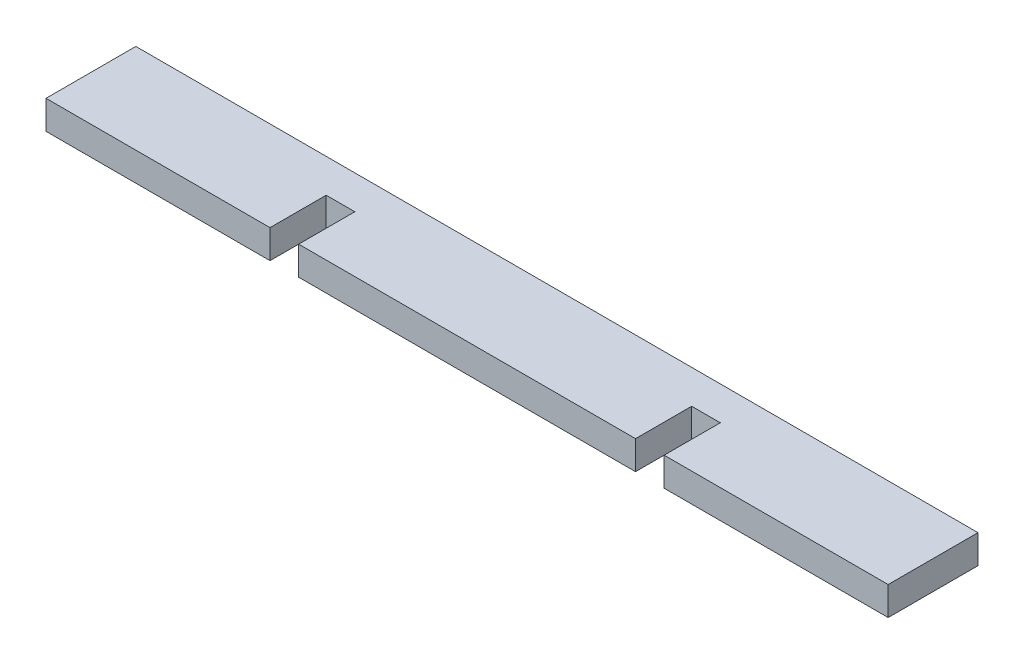
ISO-10303-21;
HEADER;
FILE_DESCRIPTION(('STEP AP214'),'2;1');
FILE_NAME('part.step','',(''),(''),'','','');
FILE_SCHEMA(('AUTOMOTIVE_DESIGN { 1 0 10303 214 1 1 1 1 }'));
ENDSEC;
DATA;
#1=APPLICATION_CONTEXT('core data for automotive mechanical design processes');
#2=APPLICATION_PROTOCOL_DEFINITION('international standard','automotive_design',2000,#1);
#3=PRODUCT_CONTEXT('',#1,'mechanical');
#4=PRODUCT('Part','Part','',(#3));
#5=PRODUCT_RELATED_PRODUCT_CATEGORY('part','',(#4));
#6=PRODUCT_DEFINITION_FORMATION('','',#4);
#7=PRODUCT_DEFINITION_CONTEXT('part definition',#1,'design');
#8=PRODUCT_DEFINITION('design','',#6,#7);
#9=PRODUCT_DEFINITION_SHAPE('','',#8);
#10=(LENGTH_UNIT() NAMED_UNIT(*) SI_UNIT(.MILLI.,.METRE.));
#11=(NAMED_UNIT(*) PLANE_ANGLE_UNIT() SI_UNIT($,.RADIAN.));
#12=(NAMED_UNIT(*) SI_UNIT($,.STERADIAN.) SOLID_ANGLE_UNIT());
#13=UNCERTAINTY_MEASURE_WITH_UNIT(LENGTH_MEASURE(1.E-05),#10,'distance_accuracy_value','');
#14=(GEOMETRIC_REPRESENTATION_CONTEXT(3) GLOBAL_UNCERTAINTY_ASSIGNED_CONTEXT((#13)) GLOBAL_UNIT_ASSIGNED_CONTEXT((#10,
#11,#12)) REPRESENTATION_CONTEXT('',''));
#15=CARTESIAN_POINT('',(0.,0.,0.));
#16=DIRECTION('',(0.,0.,1.));
#17=DIRECTION('',(1.,0.,0.));
#18=AXIS2_PLACEMENT_3D('',#15,#16,#17);
#19=CARTESIAN_POINT('',(-75.,5.1,8.00000000000001));
#20=DIRECTION('',(1.,0.,0.));
#21=DIRECTION('',(0.,0.,-1.));
#22=AXIS2_PLACEMENT_3D('',#19,#20,#21);
#23=PLANE('',#22);
#24=DIRECTION('',(0.,0.,1.));
#25=VECTOR('',#24,1.);
#26=CARTESIAN_POINT('',(-75.,0.,8.00000000000001));
#27=LINE('',#26,#25);
#28=CARTESIAN_POINT('',(-75.,0.,-7.99999999999999));
#29=VERTEX_POINT('',#28);
#30=CARTESIAN_POINT('',(-75.,0.,8.00000000000001));
#31=VERTEX_POINT('',#30);
#32=EDGE_CURVE('E153',#29,#31,#27,.T.);
#33=ORIENTED_EDGE('',*,*,#32,.T.);
#34=DIRECTION('',(0.,-1.,0.));
#35=VECTOR('',#34,1.);
#36=CARTESIAN_POINT('',(-75.,5.1,8.00000000000001));
#37=LINE('',#36,#35);
#38=CARTESIAN_POINT('',(-75.,5.1,8.00000000000001));
#39=VERTEX_POINT('',#38);
#40=EDGE_CURVE('E11',#39,#31,#37,.T.);
#41=ORIENTED_EDGE('',*,*,#40,.F.);
#42=DIRECTION('',(0.,0.,1.));
#43=VECTOR('',#42,1.);
#44=CARTESIAN_POINT('',(-75.,5.1,8.00000000000001));
#45=LINE('',#44,#43);
#46=CARTESIAN_POINT('',(-75.,5.1,-7.99999999999999));
#47=VERTEX_POINT('',#46);
#48=EDGE_CURVE('E175',#47,#39,#45,.T.);
#49=ORIENTED_EDGE('',*,*,#48,.F.);
#50=DIRECTION('',(0.,-1.,0.));
#51=VECTOR('',#50,1.);
#52=CARTESIAN_POINT('',(-75.,5.1,-7.99999999999999));
#53=LINE('',#52,#51);
#54=EDGE_CURVE('E149',#47,#29,#53,.T.);
#55=ORIENTED_EDGE('',*,*,#54,.T.);
#56=EDGE_LOOP('',(#33,#41,#49,#55));
#57=FACE_BOUND('',#56,.T.);
#58=ADVANCED_FACE('F33',(#57),#23,.F.);
#59=CARTESIAN_POINT('',(-35.1,5.1,8.00000000000001));
#60=DIRECTION('',(0.,0.,-1.));
#61=DIRECTION('',(-1.,0.,0.));
#62=AXIS2_PLACEMENT_3D('',#59,#60,#61);
#63=PLANE('',#62);
#64=DIRECTION('',(1.,0.,0.));
#65=VECTOR('',#64,1.);
#66=CARTESIAN_POINT('',(-35.1,0.,8.00000000000001));
#67=LINE('',#66,#65);
#68=CARTESIAN_POINT('',(-35.1,0.,8.00000000000001));
#69=VERTEX_POINT('',#68);
#70=EDGE_CURVE('E156',#31,#69,#67,.T.);
#71=ORIENTED_EDGE('',*,*,#70,.T.);
#72=DIRECTION('',(0.,-1.,0.));
#73=VECTOR('',#72,1.);
#74=CARTESIAN_POINT('',(-35.1,5.1,8.00000000000001));
#75=LINE('',#74,#73);
#76=CARTESIAN_POINT('',(-35.1,5.1,8.00000000000001));
#77=VERTEX_POINT('',#76);
#78=EDGE_CURVE('E41',#77,#69,#75,.T.);
#79=ORIENTED_EDGE('',*,*,#78,.F.);
#80=DIRECTION('',(1.,0.,0.));
#81=VECTOR('',#80,1.);
#82=CARTESIAN_POINT('',(-35.1,5.1,8.00000000000001));
#83=LINE('',#82,#81);
#84=EDGE_CURVE('E104',#39,#77,#83,.T.);
#85=ORIENTED_EDGE('',*,*,#84,.F.);
#86=ORIENTED_EDGE('',*,*,#40,.T.);
#87=EDGE_LOOP('',(#71,#79,#85,#86));
#88=FACE_BOUND('',#87,.T.);
#89=ADVANCED_FACE('F253',(#88),#63,.F.);
#90=CARTESIAN_POINT('',(-35.1,5.1,8.00000000000001));
#91=DIRECTION('',(-1.,0.,0.));
#92=DIRECTION('',(0.,0.,1.));
#93=AXIS2_PLACEMENT_3D('',#90,#91,#92);
#94=PLANE('',#93);
#95=DIRECTION('',(0.,0.,-1.));
#96=VECTOR('',#95,1.);
#97=CARTESIAN_POINT('',(-35.1,0.,8.00000000000001));
#98=LINE('',#97,#96);
#99=CARTESIAN_POINT('',(-35.1,0.,-2.));
#100=VERTEX_POINT('',#99);
#101=EDGE_CURVE('E158',#69,#100,#98,.T.);
#102=ORIENTED_EDGE('',*,*,#101,.T.);
#103=DIRECTION('',(0.,-1.,0.));
#104=VECTOR('',#103,1.);
#105=CARTESIAN_POINT('',(-35.1,5.1,-2.));
#106=LINE('',#105,#104);
#107=CARTESIAN_POINT('',(-35.1,5.1,-2.));
#108=VERTEX_POINT('',#107);
#109=EDGE_CURVE('E194',#108,#100,#106,.T.);
#110=ORIENTED_EDGE('',*,*,#109,.F.);
#111=DIRECTION('',(0.,0.,-1.));
#112=VECTOR('',#111,1.);
#113=CARTESIAN_POINT('',(-35.1,5.1,8.00000000000001));
#114=LINE('',#113,#112);
#115=EDGE_CURVE('E202',#77,#108,#114,.T.);
#116=ORIENTED_EDGE('',*,*,#115,.F.);
#117=ORIENTED_EDGE('',*,*,#78,.T.);
#118=EDGE_LOOP('',(#102,#110,#116,#117));
#119=FACE_BOUND('',#118,.T.);
#120=ADVANCED_FACE('F200',(#119),#94,.F.);
#121=CARTESIAN_POINT('',(-35.1,5.1,-2.));
#122=DIRECTION('',(0.,0.,-1.));
#123=DIRECTION('',(-1.,0.,0.));
#124=AXIS2_PLACEMENT_3D('',#121,#122,#123);
#125=PLANE('',#124);
#126=DIRECTION('',(1.,0.,0.));
#127=VECTOR('',#126,1.);
#128=CARTESIAN_POINT('',(-35.1,0.,-2.));
#129=LINE('',#128,#127);
#130=CARTESIAN_POINT('',(-30.,0.,-2.));
#131=VERTEX_POINT('',#130);
#132=EDGE_CURVE('E160',#100,#131,#129,.T.);
#133=ORIENTED_EDGE('',*,*,#132,.T.);
#134=DIRECTION('',(0.,-1.,0.));
#135=VECTOR('',#134,1.);
#136=CARTESIAN_POINT('',(-30.,5.1,-2.));
#137=LINE('',#136,#135);
#138=CARTESIAN_POINT('',(-30.,5.1,-2.));
#139=VERTEX_POINT('',#138);
#140=EDGE_CURVE('E191',#139,#131,#137,.T.);
#141=ORIENTED_EDGE('',*,*,#140,.F.);
#142=DIRECTION('',(1.,0.,0.));
#143=VECTOR('',#142,1.);
#144=CARTESIAN_POINT('',(-35.1,5.1,-2.));
#145=LINE('',#144,#143);
#146=EDGE_CURVE('E220',#108,#139,#145,.T.);
#147=ORIENTED_EDGE('',*,*,#146,.F.);
#148=ORIENTED_EDGE('',*,*,#109,.T.);
#149=EDGE_LOOP('',(#133,#141,#147,#148));
#150=FACE_BOUND('',#149,.T.);
#151=ADVANCED_FACE('F211',(#150),#125,.F.);
#152=CARTESIAN_POINT('',(-30.,5.1,-2.));
#153=DIRECTION('',(1.,0.,0.));
#154=DIRECTION('',(0.,0.,-1.));
#155=AXIS2_PLACEMENT_3D('',#152,#153,#154);
#156=PLANE('',#155);
#157=DIRECTION('',(0.,0.,1.));
#158=VECTOR('',#157,1.);
#159=CARTESIAN_POINT('',(-30.,0.,-2.));
#160=LINE('',#159,#158);
#161=CARTESIAN_POINT('',(-30.,0.,8.));
#162=VERTEX_POINT('',#161);
#163=EDGE_CURVE('E162',#131,#162,#160,.T.);
#164=ORIENTED_EDGE('',*,*,#163,.T.);
#165=DIRECTION('',(0.,-1.,0.));
#166=VECTOR('',#165,1.);
#167=CARTESIAN_POINT('',(-30.,5.1,8.));
#168=LINE('',#167,#166);
#169=CARTESIAN_POINT('',(-30.,5.1,8.));
#170=VERTEX_POINT('',#169);
#171=EDGE_CURVE('E188',#170,#162,#168,.T.);
#172=ORIENTED_EDGE('',*,*,#171,.F.);
#173=DIRECTION('',(0.,0.,1.));
#174=VECTOR('',#173,1.);
#175=CARTESIAN_POINT('',(-30.,5.1,-2.));
#176=LINE('',#175,#174);
#177=EDGE_CURVE('E217',#139,#170,#176,.T.);
#178=ORIENTED_EDGE('',*,*,#177,.F.);
#179=ORIENTED_EDGE('',*,*,#140,.T.);
#180=EDGE_LOOP('',(#164,#172,#178,#179));
#181=FACE_BOUND('',#180,.T.);
#182=ADVANCED_FACE('F215',(#181),#156,.F.);
#183=CARTESIAN_POINT('',(30.,5.1,8.));
#184=DIRECTION('',(0.,0.,-1.));
#185=DIRECTION('',(-1.,0.,0.));
#186=AXIS2_PLACEMENT_3D('',#183,#184,#185);
#187=PLANE('',#186);
#188=DIRECTION('',(1.,0.,0.));
#189=VECTOR('',#188,1.);
#190=CARTESIAN_POINT('',(30.,0.,8.));
#191=LINE('',#190,#189);
#192=CARTESIAN_POINT('',(30.,0.,8.));
#193=VERTEX_POINT('',#192);
#194=EDGE_CURVE('E164',#162,#193,#191,.T.);
#195=ORIENTED_EDGE('',*,*,#194,.T.);
#196=DIRECTION('',(0.,-1.,0.));
#197=VECTOR('',#196,1.);
#198=CARTESIAN_POINT('',(30.,5.1,8.));
#199=LINE('',#198,#197);
#200=CARTESIAN_POINT('',(30.,5.1,8.));
#201=VERTEX_POINT('',#200);
#202=EDGE_CURVE('E185',#201,#193,#199,.T.);
#203=ORIENTED_EDGE('',*,*,#202,.F.);
#204=DIRECTION('',(1.,0.,0.));
#205=VECTOR('',#204,1.);
#206=CARTESIAN_POINT('',(30.,5.1,8.));
#207=LINE('',#206,#205);
#208=EDGE_CURVE('E219',#170,#201,#207,.T.);
#209=ORIENTED_EDGE('',*,*,#208,.F.);
#210=ORIENTED_EDGE('',*,*,#171,.T.);
#211=EDGE_LOOP('',(#195,#203,#209,#210));
#212=FACE_BOUND('',#211,.T.);
#213=ADVANCED_FACE('F266',(#212),#187,.F.);
#214=CARTESIAN_POINT('',(30.,5.1,8.));
#215=DIRECTION('',(-1.,0.,0.));
#216=DIRECTION('',(0.,0.,1.));
#217=AXIS2_PLACEMENT_3D('',#214,#215,#216);
#218=PLANE('',#217);
#219=DIRECTION('',(0.,0.,-1.));
#220=VECTOR('',#219,1.);
#221=CARTESIAN_POINT('',(30.,0.,8.));
#222=LINE('',#221,#220);
#223=CARTESIAN_POINT('',(30.,0.,-2.));
#224=VERTEX_POINT('',#223);
#225=EDGE_CURVE('E166',#193,#224,#222,.T.);
#226=ORIENTED_EDGE('',*,*,#225,.T.);
#227=DIRECTION('',(0.,-1.,0.));
#228=VECTOR('',#227,1.);
#229=CARTESIAN_POINT('',(30.,5.1,-2.));
#230=LINE('',#229,#228);
#231=CARTESIAN_POINT('',(30.,5.1,-2.));
#232=VERTEX_POINT('',#231);
#233=EDGE_CURVE('E182',#232,#224,#230,.T.);
#234=ORIENTED_EDGE('',*,*,#233,.F.);
#235=DIRECTION('',(0.,0.,-1.));
#236=VECTOR('',#235,1.);
#237=CARTESIAN_POINT('',(30.,5.1,8.));
#238=LINE('',#237,#236);
#239=EDGE_CURVE('E222',#201,#232,#238,.T.);
#240=ORIENTED_EDGE('',*,*,#239,.F.);
#241=ORIENTED_EDGE('',*,*,#202,.T.);
#242=EDGE_LOOP('',(#226,#234,#240,#241));
#243=FACE_BOUND('',#242,.T.);
#244=ADVANCED_FACE('F269',(#243),#218,.F.);
#245=CARTESIAN_POINT('',(30.,5.1,-2.));
#246=DIRECTION('',(0.,0.,-1.));
#247=DIRECTION('',(-1.,0.,0.));
#248=AXIS2_PLACEMENT_3D('',#245,#246,#247);
#249=PLANE('',#248);
#250=DIRECTION('',(1.,0.,0.));
#251=VECTOR('',#250,1.);
#252=CARTESIAN_POINT('',(30.,0.,-2.));
#253=LINE('',#252,#251);
#254=CARTESIAN_POINT('',(35.1,0.,-2.));
#255=VERTEX_POINT('',#254);
#256=EDGE_CURVE('E168',#224,#255,#253,.T.);
#257=ORIENTED_EDGE('',*,*,#256,.T.);
#258=DIRECTION('',(0.,-1.,0.));
#259=VECTOR('',#258,1.);
#260=CARTESIAN_POINT('',(35.1,5.1,-2.));
#261=LINE('',#260,#259);
#262=CARTESIAN_POINT('',(35.1,5.1,-2.));
#263=VERTEX_POINT('',#262);
#264=EDGE_CURVE('E179',#263,#255,#261,.T.);
#265=ORIENTED_EDGE('',*,*,#264,.F.);
#266=DIRECTION('',(1.,0.,0.));
#267=VECTOR('',#266,1.);
#268=CARTESIAN_POINT('',(30.,5.1,-2.));
#269=LINE('',#268,#267);
#270=EDGE_CURVE('E228',#232,#263,#269,.T.);
#271=ORIENTED_EDGE('',*,*,#270,.F.);
#272=ORIENTED_EDGE('',*,*,#233,.T.);
#273=EDGE_LOOP('',(#257,#265,#271,#272));
#274=FACE_BOUND('',#273,.T.);
#275=ADVANCED_FACE('F234',(#274),#249,.F.);
#276=CARTESIAN_POINT('',(35.1,5.1,-2.));
#277=DIRECTION('',(1.,0.,0.));
#278=DIRECTION('',(0.,0.,-1.));
#279=AXIS2_PLACEMENT_3D('',#276,#277,#278);
#280=PLANE('',#279);
#281=DIRECTION('',(0.,0.,1.));
#282=VECTOR('',#281,1.);
#283=CARTESIAN_POINT('',(35.1,0.,-2.));
#284=LINE('',#283,#282);
#285=CARTESIAN_POINT('',(35.1,0.,8.));
#286=VERTEX_POINT('',#285);
#287=EDGE_CURVE('E170',#255,#286,#284,.T.);
#288=ORIENTED_EDGE('',*,*,#287,.T.);
#289=DIRECTION('',(0.,-1.,0.));
#290=VECTOR('',#289,1.);
#291=CARTESIAN_POINT('',(35.1,5.1,8.));
#292=LINE('',#291,#290);
#293=CARTESIAN_POINT('',(35.1,5.1,8.));
#294=VERTEX_POINT('',#293);
#295=EDGE_CURVE('E144',#294,#286,#292,.T.);
#296=ORIENTED_EDGE('',*,*,#295,.F.);
#297=DIRECTION('',(0.,0.,1.));
#298=VECTOR('',#297,1.);
#299=CARTESIAN_POINT('',(35.1,5.1,-2.));
#300=LINE('',#299,#298);
#301=EDGE_CURVE('E135',#263,#294,#300,.T.);
#302=ORIENTED_EDGE('',*,*,#301,.F.);
#303=ORIENTED_EDGE('',*,*,#264,.T.);
#304=EDGE_LOOP('',(#288,#296,#302,#303));
#305=FACE_BOUND('',#304,.T.);
#306=ADVANCED_FACE('F238',(#305),#280,.F.);
#307=CARTESIAN_POINT('',(75.,5.1,7.99999999999999));
#308=DIRECTION('',(0.,0.,-1.));
#309=DIRECTION('',(-1.,0.,0.));
#310=AXIS2_PLACEMENT_3D('',#307,#308,#309);
#311=PLANE('',#310);
#312=DIRECTION('',(1.,0.,0.));
#313=VECTOR('',#312,1.);
#314=CARTESIAN_POINT('',(75.,0.,7.99999999999999));
#315=LINE('',#314,#313);
#316=CARTESIAN_POINT('',(75.,0.,7.99999999999999));
#317=VERTEX_POINT('',#316);
#318=EDGE_CURVE('E143',#286,#317,#315,.T.);
#319=ORIENTED_EDGE('',*,*,#318,.T.);
#320=DIRECTION('',(0.,-1.,0.));
#321=VECTOR('',#320,1.);
#322=CARTESIAN_POINT('',(75.,5.1,7.99999999999999));
#323=LINE('',#322,#321);
#324=CARTESIAN_POINT('',(75.,5.1,7.99999999999999));
#325=VERTEX_POINT('',#324);
#326=EDGE_CURVE('E140',#325,#317,#323,.T.);
#327=ORIENTED_EDGE('',*,*,#326,.F.);
#328=DIRECTION('',(1.,0.,0.));
#329=VECTOR('',#328,1.);
#330=CARTESIAN_POINT('',(75.,5.1,7.99999999999999));
#331=LINE('',#330,#329);
#332=EDGE_CURVE('E129',#294,#325,#331,.T.);
#333=ORIENTED_EDGE('',*,*,#332,.F.);
#334=ORIENTED_EDGE('',*,*,#295,.T.);
#335=EDGE_LOOP('',(#319,#327,#333,#334));
#336=FACE_BOUND('',#335,.T.);
#337=ADVANCED_FACE('F141',(#336),#311,.F.);
#338=CARTESIAN_POINT('',(75.,5.1,7.99999999999999));
#339=DIRECTION('',(-1.,0.,0.));
#340=DIRECTION('',(0.,0.,1.));
#341=AXIS2_PLACEMENT_3D('',#338,#339,#340);
#342=PLANE('',#341);
#343=DIRECTION('',(0.,0.,-1.));
#344=VECTOR('',#343,1.);
#345=CARTESIAN_POINT('',(75.,0.,7.99999999999999));
#346=LINE('',#345,#344);
#347=CARTESIAN_POINT('',(75.,0.,-8.00000000000001));
#348=VERTEX_POINT('',#347);
#349=EDGE_CURVE('E90',#317,#348,#346,.T.);
#350=ORIENTED_EDGE('',*,*,#349,.T.);
#351=DIRECTION('',(0.,-1.,0.));
#352=VECTOR('',#351,1.);
#353=CARTESIAN_POINT('',(75.,5.1,-8.00000000000001));
#354=LINE('',#353,#352);
#355=CARTESIAN_POINT('',(75.,5.1,-8.00000000000001));
#356=VERTEX_POINT('',#355);
#357=EDGE_CURVE('E145',#356,#348,#354,.T.);
#358=ORIENTED_EDGE('',*,*,#357,.F.);
#359=DIRECTION('',(0.,0.,-1.));
#360=VECTOR('',#359,1.);
#361=CARTESIAN_POINT('',(75.,5.1,7.99999999999999));
#362=LINE('',#361,#360);
#363=EDGE_CURVE('E133',#325,#356,#362,.T.);
#364=ORIENTED_EDGE('',*,*,#363,.F.);
#365=ORIENTED_EDGE('',*,*,#326,.T.);
#366=EDGE_LOOP('',(#350,#358,#364,#365));
#367=FACE_BOUND('',#366,.T.);
#368=ADVANCED_FACE('F147',(#367),#342,.F.);
#369=CARTESIAN_POINT('',(75.,5.1,-8.00000000000001));
#370=DIRECTION('',(0.,0.,1.));
#371=DIRECTION('',(1.,0.,0.));
#372=AXIS2_PLACEMENT_3D('',#369,#370,#371);
#373=PLANE('',#372);
#374=DIRECTION('',(-1.,0.,0.));
#375=VECTOR('',#374,1.);
#376=CARTESIAN_POINT('',(75.,0.,-8.00000000000001));
#377=LINE('',#376,#375);
#378=EDGE_CURVE('E96',#348,#29,#377,.T.);
#379=ORIENTED_EDGE('',*,*,#378,.T.);
#380=ORIENTED_EDGE('',*,*,#54,.F.);
#381=DIRECTION('',(-1.,0.,0.));
#382=VECTOR('',#381,1.);
#383=CARTESIAN_POINT('',(75.,5.1,-8.00000000000001));
#384=LINE('',#383,#382);
#385=EDGE_CURVE('E49',#356,#47,#384,.T.);
#386=ORIENTED_EDGE('',*,*,#385,.F.);
#387=ORIENTED_EDGE('',*,*,#357,.T.);
#388=EDGE_LOOP('',(#379,#380,#386,#387));
#389=FACE_BOUND('',#388,.T.);
#390=ADVANCED_FACE('F242',(#389),#373,.F.);
#391=CARTESIAN_POINT('',(0.,5.1,0.));
#392=DIRECTION('',(0.,1.,0.));
#393=DIRECTION('',(0.,0.,1.));
#394=AXIS2_PLACEMENT_3D('',#391,#392,#393);
#395=PLANE('',#394);
#396=ORIENTED_EDGE('',*,*,#48,.T.);
#397=ORIENTED_EDGE('',*,*,#84,.T.);
#398=ORIENTED_EDGE('',*,*,#115,.T.);
#399=ORIENTED_EDGE('',*,*,#146,.T.);
#400=ORIENTED_EDGE('',*,*,#177,.T.);
#401=ORIENTED_EDGE('',*,*,#208,.T.);
#402=ORIENTED_EDGE('',*,*,#239,.T.);
#403=ORIENTED_EDGE('',*,*,#270,.T.);
#404=ORIENTED_EDGE('',*,*,#301,.T.);
#405=ORIENTED_EDGE('',*,*,#332,.T.);
#406=ORIENTED_EDGE('',*,*,#363,.T.);
#407=ORIENTED_EDGE('',*,*,#385,.T.);
#408=EDGE_LOOP('',(#396,#397,#398,#399,#400,#401,#402,#403,#404,#405,#406,#407));
#409=FACE_BOUND('',#408,.T.);
#410=ADVANCED_FACE('F131',(#409),#395,.T.);
#411=CARTESIAN_POINT('',(0.,0.,0.));
#412=DIRECTION('',(0.,1.,0.));
#413=DIRECTION('',(0.,0.,1.));
#414=AXIS2_PLACEMENT_3D('',#411,#412,#413);
#415=PLANE('',#414);
#416=ORIENTED_EDGE('',*,*,#32,.F.);
#417=ORIENTED_EDGE('',*,*,#378,.F.);
#418=ORIENTED_EDGE('',*,*,#349,.F.);
#419=ORIENTED_EDGE('',*,*,#318,.F.);
#420=ORIENTED_EDGE('',*,*,#287,.F.);
#421=ORIENTED_EDGE('',*,*,#256,.F.);
#422=ORIENTED_EDGE('',*,*,#225,.F.);
#423=ORIENTED_EDGE('',*,*,#194,.F.);
#424=ORIENTED_EDGE('',*,*,#163,.F.);
#425=ORIENTED_EDGE('',*,*,#132,.F.);
#426=ORIENTED_EDGE('',*,*,#101,.F.);
#427=ORIENTED_EDGE('',*,*,#70,.F.);
#428=EDGE_LOOP('',(#416,#417,#418,#419,#420,#421,#422,#423,#424,#425,#426,#427));
#429=FACE_BOUND('',#428,.T.);
#430=ADVANCED_FACE('F206',(#429),#415,.F.);
#431=CLOSED_SHELL('',(#58,#89,#120,#151,#182,#213,#244,#275,#306,#337,#368,#390,#410,#430));
#432=MANIFOLD_SOLID_BREP('B2',#431);
#433=ADVANCED_BREP_SHAPE_REPRESENTATION('',(#18,#432),#14);
#434=SHAPE_DEFINITION_REPRESENTATION(#9,#433);
ENDSEC;
END-ISO-10303-21;
